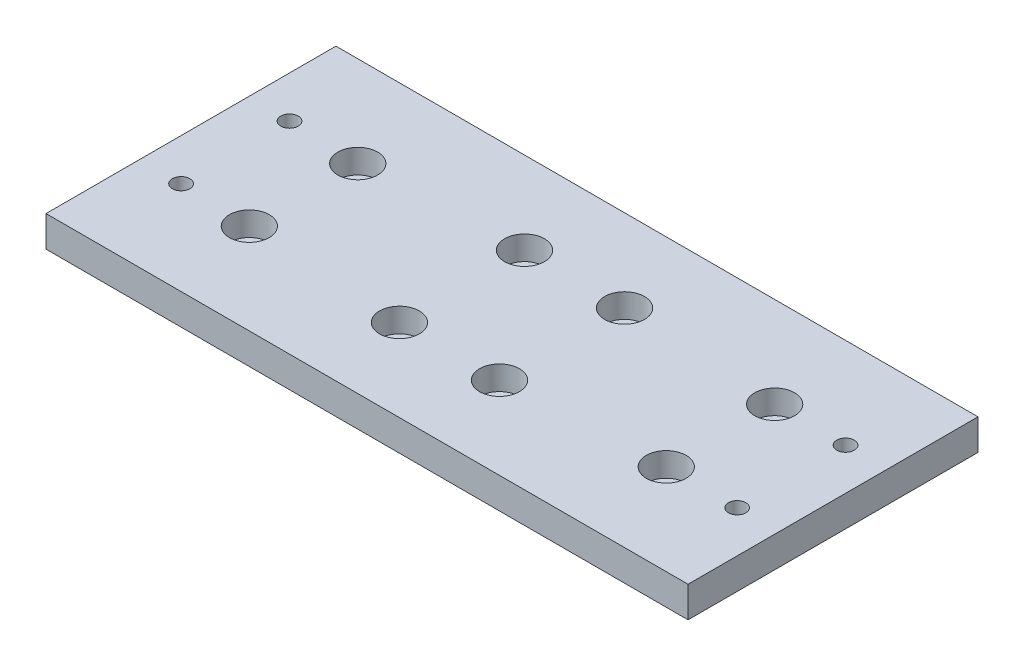
ISO-10303-21;
HEADER;
FILE_DESCRIPTION(('STEP AP214'),'2;1');
FILE_NAME('part.step','',(''),(''),'','','');
FILE_SCHEMA(('AUTOMOTIVE_DESIGN { 1 0 10303 214 1 1 1 1 }'));
ENDSEC;
DATA;
#1=APPLICATION_CONTEXT('core data for automotive mechanical design processes');
#2=APPLICATION_PROTOCOL_DEFINITION('international standard','automotive_design',2000,#1);
#3=PRODUCT_CONTEXT('',#1,'mechanical');
#4=PRODUCT('Part','Part','',(#3));
#5=PRODUCT_RELATED_PRODUCT_CATEGORY('part','',(#4));
#6=PRODUCT_DEFINITION_FORMATION('','',#4);
#7=PRODUCT_DEFINITION_CONTEXT('part definition',#1,'design');
#8=PRODUCT_DEFINITION('design','',#6,#7);
#9=PRODUCT_DEFINITION_SHAPE('','',#8);
#10=(LENGTH_UNIT() NAMED_UNIT(*) SI_UNIT(.MILLI.,.METRE.));
#11=(NAMED_UNIT(*) PLANE_ANGLE_UNIT() SI_UNIT($,.RADIAN.));
#12=(NAMED_UNIT(*) SI_UNIT($,.STERADIAN.) SOLID_ANGLE_UNIT());
#13=UNCERTAINTY_MEASURE_WITH_UNIT(LENGTH_MEASURE(1.E-05),#10,'distance_accuracy_value','');
#14=(GEOMETRIC_REPRESENTATION_CONTEXT(3) GLOBAL_UNCERTAINTY_ASSIGNED_CONTEXT((#13)) GLOBAL_UNIT_ASSIGNED_CONTEXT((#10,
#11,#12)) REPRESENTATION_CONTEXT('',''));
#15=CARTESIAN_POINT('',(0.,0.,0.));
#16=DIRECTION('',(0.,0.,1.));
#17=DIRECTION('',(1.,0.,0.));
#18=AXIS2_PLACEMENT_3D('',#15,#16,#17);
#19=CARTESIAN_POINT('',(-77.,-7.4,34.775));
#20=DIRECTION('',(-1.,0.,0.));
#21=DIRECTION('',(0.,0.,1.));
#22=AXIS2_PLACEMENT_3D('',#19,#20,#21);
#23=PLANE('',#22);
#24=DIRECTION('',(0.,0.,1.));
#25=VECTOR('',#24,1.);
#26=CARTESIAN_POINT('',(-77.,0.,34.775));
#27=LINE('',#26,#25);
#28=CARTESIAN_POINT('',(-77.,0.,-34.775));
#29=VERTEX_POINT('',#28);
#30=CARTESIAN_POINT('',(-77.,0.,34.775));
#31=VERTEX_POINT('',#30);
#32=EDGE_CURVE('E110',#29,#31,#27,.T.);
#33=ORIENTED_EDGE('',*,*,#32,.F.);
#34=DIRECTION('',(0.,1.,0.));
#35=VECTOR('',#34,1.);
#36=CARTESIAN_POINT('',(-77.,-7.4,-34.775));
#37=LINE('',#36,#35);
#38=CARTESIAN_POINT('',(-77.,-7.4,-34.775));
#39=VERTEX_POINT('',#38);
#40=EDGE_CURVE('E11',#39,#29,#37,.T.);
#41=ORIENTED_EDGE('',*,*,#40,.F.);
#42=DIRECTION('',(0.,0.,1.));
#43=VECTOR('',#42,1.);
#44=CARTESIAN_POINT('',(-77.,-7.4,34.775));
#45=LINE('',#44,#43);
#46=CARTESIAN_POINT('',(-77.,-7.4,34.775));
#47=VERTEX_POINT('',#46);
#48=EDGE_CURVE('E99',#39,#47,#45,.T.);
#49=ORIENTED_EDGE('',*,*,#48,.T.);
#50=DIRECTION('',(0.,1.,0.));
#51=VECTOR('',#50,1.);
#52=CARTESIAN_POINT('',(-77.,-7.4,34.775));
#53=LINE('',#52,#51);
#54=EDGE_CURVE('E44',#47,#31,#53,.T.);
#55=ORIENTED_EDGE('',*,*,#54,.T.);
#56=EDGE_LOOP('',(#33,#41,#49,#55));
#57=FACE_BOUND('',#56,.T.);
#58=ADVANCED_FACE('F45',(#57),#23,.T.);
#59=CARTESIAN_POINT('',(77.,-7.4,-34.775));
#60=DIRECTION('',(0.,0.,-1.));
#61=DIRECTION('',(-1.,0.,0.));
#62=AXIS2_PLACEMENT_3D('',#59,#60,#61);
#63=PLANE('',#62);
#64=DIRECTION('',(-1.,0.,0.));
#65=VECTOR('',#64,1.);
#66=CARTESIAN_POINT('',(77.,0.,-34.775));
#67=LINE('',#66,#65);
#68=CARTESIAN_POINT('',(77.,0.,-34.775));
#69=VERTEX_POINT('',#68);
#70=EDGE_CURVE('E105',#69,#29,#67,.T.);
#71=ORIENTED_EDGE('',*,*,#70,.F.);
#72=DIRECTION('',(0.,1.,0.));
#73=VECTOR('',#72,1.);
#74=CARTESIAN_POINT('',(77.,-7.4,-34.775));
#75=LINE('',#74,#73);
#76=CARTESIAN_POINT('',(77.,-7.4,-34.775));
#77=VERTEX_POINT('',#76);
#78=EDGE_CURVE('E51',#77,#69,#75,.T.);
#79=ORIENTED_EDGE('',*,*,#78,.F.);
#80=DIRECTION('',(-1.,0.,0.));
#81=VECTOR('',#80,1.);
#82=CARTESIAN_POINT('',(77.,-7.4,-34.775));
#83=LINE('',#82,#81);
#84=EDGE_CURVE('E100',#77,#39,#83,.T.);
#85=ORIENTED_EDGE('',*,*,#84,.T.);
#86=ORIENTED_EDGE('',*,*,#40,.T.);
#87=EDGE_LOOP('',(#71,#79,#85,#86));
#88=FACE_BOUND('',#87,.T.);
#89=ADVANCED_FACE('F119',(#88),#63,.T.);
#90=CARTESIAN_POINT('',(77.,-7.4,34.775));
#91=DIRECTION('',(1.,0.,0.));
#92=DIRECTION('',(0.,0.,-1.));
#93=AXIS2_PLACEMENT_3D('',#90,#91,#92);
#94=PLANE('',#93);
#95=DIRECTION('',(0.,0.,-1.));
#96=VECTOR('',#95,1.);
#97=CARTESIAN_POINT('',(77.,0.,34.775));
#98=LINE('',#97,#96);
#99=CARTESIAN_POINT('',(77.,0.,34.775));
#100=VERTEX_POINT('',#99);
#101=EDGE_CURVE('E95',#100,#69,#98,.T.);
#102=ORIENTED_EDGE('',*,*,#101,.F.);
#103=DIRECTION('',(0.,1.,0.));
#104=VECTOR('',#103,1.);
#105=CARTESIAN_POINT('',(77.,-7.4,34.775));
#106=LINE('',#105,#104);
#107=CARTESIAN_POINT('',(77.,-7.4,34.775));
#108=VERTEX_POINT('',#107);
#109=EDGE_CURVE('E87',#108,#100,#106,.T.);
#110=ORIENTED_EDGE('',*,*,#109,.F.);
#111=DIRECTION('',(0.,0.,-1.));
#112=VECTOR('',#111,1.);
#113=CARTESIAN_POINT('',(77.,-7.4,34.775));
#114=LINE('',#113,#112);
#115=EDGE_CURVE('E89',#108,#77,#114,.T.);
#116=ORIENTED_EDGE('',*,*,#115,.T.);
#117=ORIENTED_EDGE('',*,*,#78,.T.);
#118=EDGE_LOOP('',(#102,#110,#116,#117));
#119=FACE_BOUND('',#118,.T.);
#120=ADVANCED_FACE('F90',(#119),#94,.T.);
#121=CARTESIAN_POINT('',(77.,-7.4,34.775));
#122=DIRECTION('',(0.,0.,1.));
#123=DIRECTION('',(1.,0.,0.));
#124=AXIS2_PLACEMENT_3D('',#121,#122,#123);
#125=PLANE('',#124);
#126=DIRECTION('',(1.,0.,0.));
#127=VECTOR('',#126,1.);
#128=CARTESIAN_POINT('',(77.,0.,34.775));
#129=LINE('',#128,#127);
#130=EDGE_CURVE('E109',#31,#100,#129,.T.);
#131=ORIENTED_EDGE('',*,*,#130,.F.);
#132=ORIENTED_EDGE('',*,*,#54,.F.);
#133=DIRECTION('',(1.,0.,0.));
#134=VECTOR('',#133,1.);
#135=CARTESIAN_POINT('',(77.,-7.4,34.775));
#136=LINE('',#135,#134);
#137=EDGE_CURVE('E96',#47,#108,#136,.T.);
#138=ORIENTED_EDGE('',*,*,#137,.T.);
#139=ORIENTED_EDGE('',*,*,#109,.T.);
#140=EDGE_LOOP('',(#131,#132,#138,#139));
#141=FACE_BOUND('',#140,.T.);
#142=ADVANCED_FACE('F97',(#141),#125,.T.);
#143=CARTESIAN_POINT('',(0.,-7.4,0.));
#144=DIRECTION('',(0.,1.,0.));
#145=DIRECTION('',(0.,0.,1.));
#146=AXIS2_PLACEMENT_3D('',#143,#144,#145);
#147=PLANE('',#146);
#148=CARTESIAN_POINT('',(-67.,-7.4,12.3735439380438));
#149=DIRECTION('',(0.,1.,0.));
#150=DIRECTION('',(0.,0.,1.));
#151=AXIS2_PLACEMENT_3D('',#148,#149,#150);
#152=CIRCLE('',#151,2.1);
#153=CARTESIAN_POINT('',(-67.,-7.4,14.4735439380438));
#154=VERTEX_POINT('',#153);
#155=EDGE_CURVE('E275',#154,#154,#152,.T.);
#156=ORIENTED_EDGE('',*,*,#155,.T.);
#157=EDGE_LOOP('',(#156));
#158=FACE_BOUND('',#157,.T.);
#159=CARTESIAN_POINT('',(67.,-7.4,-13.));
#160=DIRECTION('',(0.,1.,0.));
#161=DIRECTION('',(0.,0.,1.));
#162=AXIS2_PLACEMENT_3D('',#159,#160,#161);
#163=CIRCLE('',#162,2.1);
#164=CARTESIAN_POINT('',(67.,-7.4,-10.9));
#165=VERTEX_POINT('',#164);
#166=EDGE_CURVE('E261',#165,#165,#163,.T.);
#167=ORIENTED_EDGE('',*,*,#166,.T.);
#168=EDGE_LOOP('',(#167));
#169=FACE_BOUND('',#168,.T.);
#170=CARTESIAN_POINT('',(67.,-7.4,13.));
#171=DIRECTION('',(0.,1.,0.));
#172=DIRECTION('',(0.,0.,1.));
#173=AXIS2_PLACEMENT_3D('',#170,#171,#172);
#174=CIRCLE('',#173,2.1);
#175=CARTESIAN_POINT('',(67.,-7.4,15.1));
#176=VERTEX_POINT('',#175);
#177=EDGE_CURVE('E258',#176,#176,#174,.T.);
#178=ORIENTED_EDGE('',*,*,#177,.T.);
#179=EDGE_LOOP('',(#178));
#180=FACE_BOUND('',#179,.T.);
#181=CARTESIAN_POINT('',(-67.,-7.4,-13.6264560619562));
#182=DIRECTION('',(0.,1.,0.));
#183=DIRECTION('',(0.,0.,1.));
#184=AXIS2_PLACEMENT_3D('',#181,#182,#183);
#185=CIRCLE('',#184,2.1);
#186=CARTESIAN_POINT('',(-67.,-7.4,-11.5264560619562));
#187=VERTEX_POINT('',#186);
#188=EDGE_CURVE('E277',#187,#187,#185,.T.);
#189=ORIENTED_EDGE('',*,*,#188,.T.);
#190=EDGE_LOOP('',(#189));
#191=FACE_BOUND('',#190,.T.);
#192=CARTESIAN_POINT('',(-50.,-7.4,13.));
#193=DIRECTION('',(0.,1.,0.));
#194=DIRECTION('',(0.,0.,1.));
#195=AXIS2_PLACEMENT_3D('',#192,#193,#194);
#196=CIRCLE('',#195,2.65);
#197=CARTESIAN_POINT('',(-50.,-7.4,15.65));
#198=VERTEX_POINT('',#197);
#199=EDGE_CURVE('E301',#198,#198,#196,.T.);
#200=ORIENTED_EDGE('',*,*,#199,.T.);
#201=EDGE_LOOP('',(#200));
#202=FACE_BOUND('',#201,.T.);
#203=CARTESIAN_POINT('',(-12.,-7.4,-15.));
#204=DIRECTION('',(0.,1.,0.));
#205=DIRECTION('',(0.,0.,1.));
#206=AXIS2_PLACEMENT_3D('',#203,#204,#205);
#207=CIRCLE('',#206,2.65);
#208=CARTESIAN_POINT('',(-12.,-7.4,-12.35));
#209=VERTEX_POINT('',#208);
#210=EDGE_CURVE('E309',#209,#209,#207,.T.);
#211=ORIENTED_EDGE('',*,*,#210,.T.);
#212=EDGE_LOOP('',(#211));
#213=FACE_BOUND('',#212,.T.);
#214=CARTESIAN_POINT('',(12.,-7.4,-15.));
#215=DIRECTION('',(0.,1.,0.));
#216=DIRECTION('',(0.,0.,1.));
#217=AXIS2_PLACEMENT_3D('',#214,#215,#216);
#218=CIRCLE('',#217,2.65);
#219=CARTESIAN_POINT('',(12.,-7.4,-12.35));
#220=VERTEX_POINT('',#219);
#221=EDGE_CURVE('E316',#220,#220,#218,.T.);
#222=ORIENTED_EDGE('',*,*,#221,.T.);
#223=EDGE_LOOP('',(#222));
#224=FACE_BOUND('',#223,.T.);
#225=CARTESIAN_POINT('',(12.,-7.4,15.));
#226=DIRECTION('',(0.,1.,0.));
#227=DIRECTION('',(0.,0.,1.));
#228=AXIS2_PLACEMENT_3D('',#225,#226,#227);
#229=CIRCLE('',#228,2.65);
#230=CARTESIAN_POINT('',(12.,-7.4,17.65));
#231=VERTEX_POINT('',#230);
#232=EDGE_CURVE('E285',#231,#231,#229,.T.);
#233=ORIENTED_EDGE('',*,*,#232,.T.);
#234=EDGE_LOOP('',(#233));
#235=FACE_BOUND('',#234,.T.);
#236=CARTESIAN_POINT('',(50.,-7.4,-13.));
#237=DIRECTION('',(0.,1.,0.));
#238=DIRECTION('',(0.,0.,1.));
#239=AXIS2_PLACEMENT_3D('',#236,#237,#238);
#240=CIRCLE('',#239,2.65);
#241=CARTESIAN_POINT('',(50.,-7.4,-10.35));
#242=VERTEX_POINT('',#241);
#243=EDGE_CURVE('E287',#242,#242,#240,.T.);
#244=ORIENTED_EDGE('',*,*,#243,.T.);
#245=EDGE_LOOP('',(#244));
#246=FACE_BOUND('',#245,.T.);
#247=CARTESIAN_POINT('',(50.,-7.4,13.));
#248=DIRECTION('',(0.,1.,0.));
#249=DIRECTION('',(0.,0.,1.));
#250=AXIS2_PLACEMENT_3D('',#247,#248,#249);
#251=CIRCLE('',#250,2.65);
#252=CARTESIAN_POINT('',(50.,-7.4,15.65));
#253=VERTEX_POINT('',#252);
#254=EDGE_CURVE('E295',#253,#253,#251,.T.);
#255=ORIENTED_EDGE('',*,*,#254,.T.);
#256=EDGE_LOOP('',(#255));
#257=FACE_BOUND('',#256,.T.);
#258=CARTESIAN_POINT('',(-12.,-7.4,15.));
#259=DIRECTION('',(0.,1.,0.));
#260=DIRECTION('',(0.,0.,1.));
#261=AXIS2_PLACEMENT_3D('',#258,#259,#260);
#262=CIRCLE('',#261,2.65);
#263=CARTESIAN_POINT('',(-12.,-7.4,17.65));
#264=VERTEX_POINT('',#263);
#265=EDGE_CURVE('E276',#264,#264,#262,.T.);
#266=ORIENTED_EDGE('',*,*,#265,.T.);
#267=EDGE_LOOP('',(#266));
#268=FACE_BOUND('',#267,.T.);
#269=CARTESIAN_POINT('',(-50.,-7.4,-13.));
#270=DIRECTION('',(0.,1.,0.));
#271=DIRECTION('',(0.,0.,1.));
#272=AXIS2_PLACEMENT_3D('',#269,#270,#271);
#273=CIRCLE('',#272,2.65);
#274=CARTESIAN_POINT('',(-50.,-7.4,-10.35));
#275=VERTEX_POINT('',#274);
#276=EDGE_CURVE('E322',#275,#275,#273,.T.);
#277=ORIENTED_EDGE('',*,*,#276,.T.);
#278=EDGE_LOOP('',(#277));
#279=FACE_BOUND('',#278,.T.);
#280=ORIENTED_EDGE('',*,*,#48,.F.);
#281=ORIENTED_EDGE('',*,*,#84,.F.);
#282=ORIENTED_EDGE('',*,*,#115,.F.);
#283=ORIENTED_EDGE('',*,*,#137,.F.);
#284=EDGE_LOOP('',(#280,#281,#282,#283));
#285=FACE_BOUND('',#284,.T.);
#286=ADVANCED_FACE('F92',(#158,#169,#180,#191,#202,#213,#224,#235,#246,#257,#268,#279,#285),
#147,.F.);
#287=CARTESIAN_POINT('',(0.,0.,0.));
#288=DIRECTION('',(0.,1.,0.));
#289=DIRECTION('',(0.,0.,1.));
#290=AXIS2_PLACEMENT_3D('',#287,#288,#289);
#291=PLANE('',#290);
#292=CARTESIAN_POINT('',(-67.,0.,12.3735439380438));
#293=DIRECTION('',(0.,1.,0.));
#294=DIRECTION('',(0.,0.,1.));
#295=AXIS2_PLACEMENT_3D('',#292,#293,#294);
#296=CIRCLE('',#295,2.1);
#297=CARTESIAN_POINT('',(-67.,0.,14.4735439380438));
#298=VERTEX_POINT('',#297);
#299=EDGE_CURVE('E268',#298,#298,#296,.T.);
#300=ORIENTED_EDGE('',*,*,#299,.F.);
#301=EDGE_LOOP('',(#300));
#302=FACE_BOUND('',#301,.T.);
#303=CARTESIAN_POINT('',(67.,0.,-13.));
#304=DIRECTION('',(0.,1.,0.));
#305=DIRECTION('',(0.,0.,1.));
#306=AXIS2_PLACEMENT_3D('',#303,#304,#305);
#307=CIRCLE('',#306,2.1);
#308=CARTESIAN_POINT('',(67.,0.,-10.9));
#309=VERTEX_POINT('',#308);
#310=EDGE_CURVE('E262',#309,#309,#307,.T.);
#311=ORIENTED_EDGE('',*,*,#310,.F.);
#312=EDGE_LOOP('',(#311));
#313=FACE_BOUND('',#312,.T.);
#314=CARTESIAN_POINT('',(67.,0.,13.));
#315=DIRECTION('',(0.,1.,0.));
#316=DIRECTION('',(0.,0.,1.));
#317=AXIS2_PLACEMENT_3D('',#314,#315,#316);
#318=CIRCLE('',#317,2.1);
#319=CARTESIAN_POINT('',(67.,0.,15.1));
#320=VERTEX_POINT('',#319);
#321=EDGE_CURVE('E259',#320,#320,#318,.T.);
#322=ORIENTED_EDGE('',*,*,#321,.F.);
#323=EDGE_LOOP('',(#322));
#324=FACE_BOUND('',#323,.T.);
#325=CARTESIAN_POINT('',(-67.,0.,-13.6264560619562));
#326=DIRECTION('',(0.,1.,0.));
#327=DIRECTION('',(0.,0.,1.));
#328=AXIS2_PLACEMENT_3D('',#325,#326,#327);
#329=CIRCLE('',#328,2.1);
#330=CARTESIAN_POINT('',(-67.,0.,-11.5264560619562));
#331=VERTEX_POINT('',#330);
#332=EDGE_CURVE('E271',#331,#331,#329,.T.);
#333=ORIENTED_EDGE('',*,*,#332,.F.);
#334=EDGE_LOOP('',(#333));
#335=FACE_BOUND('',#334,.T.);
#336=CARTESIAN_POINT('',(12.,0.,-15.));
#337=DIRECTION('',(0.,1.,0.));
#338=DIRECTION('',(0.,0.,1.));
#339=AXIS2_PLACEMENT_3D('',#336,#337,#338);
#340=CIRCLE('',#339,4.775);
#341=CARTESIAN_POINT('',(12.,0.,-10.225));
#342=VERTEX_POINT('',#341);
#343=EDGE_CURVE('E346',#342,#342,#340,.T.);
#344=ORIENTED_EDGE('',*,*,#343,.F.);
#345=EDGE_LOOP('',(#344));
#346=FACE_BOUND('',#345,.T.);
#347=CARTESIAN_POINT('',(-12.,0.,-15.));
#348=DIRECTION('',(0.,1.,0.));
#349=DIRECTION('',(0.,0.,1.));
#350=AXIS2_PLACEMENT_3D('',#347,#348,#349);
#351=CIRCLE('',#350,4.775);
#352=CARTESIAN_POINT('',(-12.,0.,-10.225));
#353=VERTEX_POINT('',#352);
#354=EDGE_CURVE('E355',#353,#353,#351,.T.);
#355=ORIENTED_EDGE('',*,*,#354,.F.);
#356=EDGE_LOOP('',(#355));
#357=FACE_BOUND('',#356,.T.);
#358=CARTESIAN_POINT('',(-50.,0.,13.));
#359=DIRECTION('',(0.,1.,0.));
#360=DIRECTION('',(0.,0.,1.));
#361=AXIS2_PLACEMENT_3D('',#358,#359,#360);
#362=CIRCLE('',#361,4.775);
#363=CARTESIAN_POINT('',(-50.,0.,17.775));
#364=VERTEX_POINT('',#363);
#365=EDGE_CURVE('E363',#364,#364,#362,.T.);
#366=ORIENTED_EDGE('',*,*,#365,.F.);
#367=EDGE_LOOP('',(#366));
#368=FACE_BOUND('',#367,.T.);
#369=CARTESIAN_POINT('',(12.,0.,15.));
#370=DIRECTION('',(0.,1.,0.));
#371=DIRECTION('',(0.,0.,1.));
#372=AXIS2_PLACEMENT_3D('',#369,#370,#371);
#373=CIRCLE('',#372,4.775);
#374=CARTESIAN_POINT('',(12.,0.,19.775));
#375=VERTEX_POINT('',#374);
#376=EDGE_CURVE('E370',#375,#375,#373,.T.);
#377=ORIENTED_EDGE('',*,*,#376,.F.);
#378=EDGE_LOOP('',(#377));
#379=FACE_BOUND('',#378,.T.);
#380=CARTESIAN_POINT('',(50.,0.,-13.));
#381=DIRECTION('',(0.,1.,0.));
#382=DIRECTION('',(0.,0.,1.));
#383=AXIS2_PLACEMENT_3D('',#380,#381,#382);
#384=CIRCLE('',#383,4.775);
#385=CARTESIAN_POINT('',(50.,0.,-8.225));
#386=VERTEX_POINT('',#385);
#387=EDGE_CURVE('E329',#386,#386,#384,.T.);
#388=ORIENTED_EDGE('',*,*,#387,.F.);
#389=EDGE_LOOP('',(#388));
#390=FACE_BOUND('',#389,.T.);
#391=CARTESIAN_POINT('',(50.,0.,13.));
#392=DIRECTION('',(0.,1.,0.));
#393=DIRECTION('',(0.,0.,1.));
#394=AXIS2_PLACEMENT_3D('',#391,#392,#393);
#395=CIRCLE('',#394,4.775);
#396=CARTESIAN_POINT('',(50.,0.,17.775));
#397=VERTEX_POINT('',#396);
#398=EDGE_CURVE('E337',#397,#397,#395,.T.);
#399=ORIENTED_EDGE('',*,*,#398,.F.);
#400=EDGE_LOOP('',(#399));
#401=FACE_BOUND('',#400,.T.);
#402=CARTESIAN_POINT('',(-12.,0.,15.));
#403=DIRECTION('',(0.,1.,0.));
#404=DIRECTION('',(0.,0.,1.));
#405=AXIS2_PLACEMENT_3D('',#402,#403,#404);
#406=CIRCLE('',#405,4.775);
#407=CARTESIAN_POINT('',(-12.,0.,19.775));
#408=VERTEX_POINT('',#407);
#409=EDGE_CURVE('E343',#408,#408,#406,.T.);
#410=ORIENTED_EDGE('',*,*,#409,.F.);
#411=EDGE_LOOP('',(#410));
#412=FACE_BOUND('',#411,.T.);
#413=CARTESIAN_POINT('',(-50.,0.,-13.));
#414=DIRECTION('',(0.,1.,0.));
#415=DIRECTION('',(0.,0.,1.));
#416=AXIS2_PLACEMENT_3D('',#413,#414,#415);
#417=CIRCLE('',#416,4.775);
#418=CARTESIAN_POINT('',(-50.,0.,-8.225));
#419=VERTEX_POINT('',#418);
#420=EDGE_CURVE('E351',#419,#419,#417,.T.);
#421=ORIENTED_EDGE('',*,*,#420,.F.);
#422=EDGE_LOOP('',(#421));
#423=FACE_BOUND('',#422,.T.);
#424=ORIENTED_EDGE('',*,*,#32,.T.);
#425=ORIENTED_EDGE('',*,*,#130,.T.);
#426=ORIENTED_EDGE('',*,*,#101,.T.);
#427=ORIENTED_EDGE('',*,*,#70,.T.);
#428=EDGE_LOOP('',(#424,#425,#426,#427));
#429=FACE_BOUND('',#428,.T.);
#430=ADVANCED_FACE('F117',(#302,#313,#324,#335,#346,#357,#368,#379,#390,#401,#412,#423,#429),
#291,.T.);
#431=CARTESIAN_POINT('',(-50.,-5.75,-13.));
#432=DIRECTION('',(0.,1.,0.));
#433=DIRECTION('',(0.,0.,1.));
#434=AXIS2_PLACEMENT_3D('',#431,#432,#433);
#435=CYLINDRICAL_SURFACE('',#434,4.775);
#436=CARTESIAN_POINT('',(-50.,-5.75,-13.));
#437=DIRECTION('',(0.,1.,0.));
#438=DIRECTION('',(0.,0.,1.));
#439=AXIS2_PLACEMENT_3D('',#436,#437,#438);
#440=CIRCLE('',#439,4.775);
#441=CARTESIAN_POINT('',(-50.,-5.75,-8.225));
#442=VERTEX_POINT('',#441);
#443=EDGE_CURVE('E112',#442,#442,#440,.T.);
#444=ORIENTED_EDGE('',*,*,#443,.F.);
#445=EDGE_LOOP('',(#444));
#446=FACE_BOUND('',#445,.T.);
#447=ORIENTED_EDGE('',*,*,#420,.T.);
#448=EDGE_LOOP('',(#447));
#449=FACE_BOUND('',#448,.T.);
#450=ADVANCED_FACE('F140',(#446,#449),#435,.F.);
#451=CARTESIAN_POINT('',(-50.,-5.75,-13.));
#452=DIRECTION('',(0.,1.,0.));
#453=DIRECTION('',(0.,0.,1.));
#454=AXIS2_PLACEMENT_3D('',#451,#452,#453);
#455=PLANE('',#454);
#456=CARTESIAN_POINT('',(-50.,-5.75,-13.));
#457=DIRECTION('',(0.,1.,0.));
#458=DIRECTION('',(0.,0.,1.));
#459=AXIS2_PLACEMENT_3D('',#456,#457,#458);
#460=CIRCLE('',#459,2.65);
#461=CARTESIAN_POINT('',(-50.,-5.75,-10.35));
#462=VERTEX_POINT('',#461);
#463=EDGE_CURVE('E305',#462,#462,#460,.T.);
#464=ORIENTED_EDGE('',*,*,#463,.F.);
#465=EDGE_LOOP('',(#464));
#466=FACE_BOUND('',#465,.T.);
#467=ORIENTED_EDGE('',*,*,#443,.T.);
#468=EDGE_LOOP('',(#467));
#469=FACE_BOUND('',#468,.T.);
#470=ADVANCED_FACE('F145',(#466,#469),#455,.T.);
#471=CARTESIAN_POINT('',(-12.,-5.75,15.));
#472=DIRECTION('',(0.,1.,0.));
#473=DIRECTION('',(0.,0.,1.));
#474=AXIS2_PLACEMENT_3D('',#471,#472,#473);
#475=CYLINDRICAL_SURFACE('',#474,4.775);
#476=CARTESIAN_POINT('',(-12.,-5.75,15.));
#477=DIRECTION('',(0.,1.,0.));
#478=DIRECTION('',(0.,0.,1.));
#479=AXIS2_PLACEMENT_3D('',#476,#477,#478);
#480=CIRCLE('',#479,4.775);
#481=CARTESIAN_POINT('',(-12.,-5.75,19.775));
#482=VERTEX_POINT('',#481);
#483=EDGE_CURVE('E330',#482,#482,#480,.T.);
#484=ORIENTED_EDGE('',*,*,#483,.F.);
#485=EDGE_LOOP('',(#484));
#486=FACE_BOUND('',#485,.T.);
#487=ORIENTED_EDGE('',*,*,#409,.T.);
#488=EDGE_LOOP('',(#487));
#489=FACE_BOUND('',#488,.T.);
#490=ADVANCED_FACE('F146',(#486,#489),#475,.F.);
#491=CARTESIAN_POINT('',(-12.,-5.75,15.));
#492=DIRECTION('',(0.,1.,0.));
#493=DIRECTION('',(0.,0.,1.));
#494=AXIS2_PLACEMENT_3D('',#491,#492,#493);
#495=PLANE('',#494);
#496=CARTESIAN_POINT('',(-12.,-5.75,15.));
#497=DIRECTION('',(0.,1.,0.));
#498=DIRECTION('',(0.,0.,1.));
#499=AXIS2_PLACEMENT_3D('',#496,#497,#498);
#500=CIRCLE('',#499,2.65);
#501=CARTESIAN_POINT('',(-12.,-5.75,17.65));
#502=VERTEX_POINT('',#501);
#503=EDGE_CURVE('E293',#502,#502,#500,.T.);
#504=ORIENTED_EDGE('',*,*,#503,.F.);
#505=EDGE_LOOP('',(#504));
#506=FACE_BOUND('',#505,.T.);
#507=ORIENTED_EDGE('',*,*,#483,.T.);
#508=EDGE_LOOP('',(#507));
#509=FACE_BOUND('',#508,.T.);
#510=ADVANCED_FACE('F184',(#506,#509),#495,.T.);
#511=CARTESIAN_POINT('',(50.,-5.75,13.));
#512=DIRECTION('',(0.,1.,0.));
#513=DIRECTION('',(0.,0.,1.));
#514=AXIS2_PLACEMENT_3D('',#511,#512,#513);
#515=CYLINDRICAL_SURFACE('',#514,4.775);
#516=CARTESIAN_POINT('',(50.,-5.75,13.));
#517=DIRECTION('',(0.,1.,0.));
#518=DIRECTION('',(0.,0.,1.));
#519=AXIS2_PLACEMENT_3D('',#516,#517,#518);
#520=CIRCLE('',#519,4.775);
#521=CARTESIAN_POINT('',(50.,-5.75,17.775));
#522=VERTEX_POINT('',#521);
#523=EDGE_CURVE('E340',#522,#522,#520,.T.);
#524=ORIENTED_EDGE('',*,*,#523,.F.);
#525=EDGE_LOOP('',(#524));
#526=FACE_BOUND('',#525,.T.);
#527=ORIENTED_EDGE('',*,*,#398,.T.);
#528=EDGE_LOOP('',(#527));
#529=FACE_BOUND('',#528,.T.);
#530=ADVANCED_FACE('F187',(#526,#529),#515,.F.);
#531=CARTESIAN_POINT('',(50.,-5.75,13.));
#532=DIRECTION('',(0.,1.,0.));
#533=DIRECTION('',(0.,0.,1.));
#534=AXIS2_PLACEMENT_3D('',#531,#532,#533);
#535=PLANE('',#534);
#536=CARTESIAN_POINT('',(50.,-5.75,13.));
#537=DIRECTION('',(0.,1.,0.));
#538=DIRECTION('',(0.,0.,1.));
#539=AXIS2_PLACEMENT_3D('',#536,#537,#538);
#540=CIRCLE('',#539,2.65);
#541=CARTESIAN_POINT('',(50.,-5.75,15.65));
#542=VERTEX_POINT('',#541);
#543=EDGE_CURVE('E289',#542,#542,#540,.T.);
#544=ORIENTED_EDGE('',*,*,#543,.F.);
#545=EDGE_LOOP('',(#544));
#546=FACE_BOUND('',#545,.T.);
#547=ORIENTED_EDGE('',*,*,#523,.T.);
#548=EDGE_LOOP('',(#547));
#549=FACE_BOUND('',#548,.T.);
#550=ADVANCED_FACE('F194',(#546,#549),#535,.T.);
#551=CARTESIAN_POINT('',(50.,-5.75,-13.));
#552=DIRECTION('',(0.,1.,0.));
#553=DIRECTION('',(0.,0.,1.));
#554=AXIS2_PLACEMENT_3D('',#551,#552,#553);
#555=CYLINDRICAL_SURFACE('',#554,4.775);
#556=CARTESIAN_POINT('',(50.,-5.75,-13.));
#557=DIRECTION('',(0.,1.,0.));
#558=DIRECTION('',(0.,0.,1.));
#559=AXIS2_PLACEMENT_3D('',#556,#557,#558);
#560=CIRCLE('',#559,4.775);
#561=CARTESIAN_POINT('',(50.,-5.75,-8.225));
#562=VERTEX_POINT('',#561);
#563=EDGE_CURVE('E331',#562,#562,#560,.T.);
#564=ORIENTED_EDGE('',*,*,#563,.F.);
#565=EDGE_LOOP('',(#564));
#566=FACE_BOUND('',#565,.T.);
#567=ORIENTED_EDGE('',*,*,#387,.T.);
#568=EDGE_LOOP('',(#567));
#569=FACE_BOUND('',#568,.T.);
#570=ADVANCED_FACE('F193',(#566,#569),#555,.F.);
#571=CARTESIAN_POINT('',(50.,-5.75,-13.));
#572=DIRECTION('',(0.,1.,0.));
#573=DIRECTION('',(0.,0.,1.));
#574=AXIS2_PLACEMENT_3D('',#571,#572,#573);
#575=PLANE('',#574);
#576=CARTESIAN_POINT('',(50.,-5.75,-13.));
#577=DIRECTION('',(0.,1.,0.));
#578=DIRECTION('',(0.,0.,1.));
#579=AXIS2_PLACEMENT_3D('',#576,#577,#578);
#580=CIRCLE('',#579,2.65);
#581=CARTESIAN_POINT('',(50.,-5.75,-10.35));
#582=VERTEX_POINT('',#581);
#583=EDGE_CURVE('E282',#582,#582,#580,.T.);
#584=ORIENTED_EDGE('',*,*,#583,.F.);
#585=EDGE_LOOP('',(#584));
#586=FACE_BOUND('',#585,.T.);
#587=ORIENTED_EDGE('',*,*,#563,.T.);
#588=EDGE_LOOP('',(#587));
#589=FACE_BOUND('',#588,.T.);
#590=ADVANCED_FACE('F158',(#586,#589),#575,.T.);
#591=CARTESIAN_POINT('',(12.,-5.75,15.));
#592=DIRECTION('',(0.,1.,0.));
#593=DIRECTION('',(0.,0.,1.));
#594=AXIS2_PLACEMENT_3D('',#591,#592,#593);
#595=CYLINDRICAL_SURFACE('',#594,4.775);
#596=CARTESIAN_POINT('',(12.,-5.75,15.));
#597=DIRECTION('',(0.,1.,0.));
#598=DIRECTION('',(0.,0.,1.));
#599=AXIS2_PLACEMENT_3D('',#596,#597,#598);
#600=CIRCLE('',#599,4.775);
#601=CARTESIAN_POINT('',(12.,-5.75,19.775));
#602=VERTEX_POINT('',#601);
#603=EDGE_CURVE('E334',#602,#602,#600,.T.);
#604=ORIENTED_EDGE('',*,*,#603,.F.);
#605=EDGE_LOOP('',(#604));
#606=FACE_BOUND('',#605,.T.);
#607=ORIENTED_EDGE('',*,*,#376,.T.);
#608=EDGE_LOOP('',(#607));
#609=FACE_BOUND('',#608,.T.);
#610=ADVANCED_FACE('F152',(#606,#609),#595,.F.);
#611=CARTESIAN_POINT('',(12.,-5.75,15.));
#612=DIRECTION('',(0.,1.,0.));
#613=DIRECTION('',(0.,0.,1.));
#614=AXIS2_PLACEMENT_3D('',#611,#612,#613);
#615=PLANE('',#614);
#616=CARTESIAN_POINT('',(12.,-5.75,15.));
#617=DIRECTION('',(0.,1.,0.));
#618=DIRECTION('',(0.,0.,1.));
#619=AXIS2_PLACEMENT_3D('',#616,#617,#618);
#620=CIRCLE('',#619,2.65);
#621=CARTESIAN_POINT('',(12.,-5.75,17.65));
#622=VERTEX_POINT('',#621);
#623=EDGE_CURVE('E317',#622,#622,#620,.T.);
#624=ORIENTED_EDGE('',*,*,#623,.F.);
#625=EDGE_LOOP('',(#624));
#626=FACE_BOUND('',#625,.T.);
#627=ORIENTED_EDGE('',*,*,#603,.T.);
#628=EDGE_LOOP('',(#627));
#629=FACE_BOUND('',#628,.T.);
#630=ADVANCED_FACE('F147',(#626,#629),#615,.T.);
#631=CARTESIAN_POINT('',(-50.,-5.75,13.));
#632=DIRECTION('',(0.,1.,0.));
#633=DIRECTION('',(0.,0.,1.));
#634=AXIS2_PLACEMENT_3D('',#631,#632,#633);
#635=CYLINDRICAL_SURFACE('',#634,4.775);
#636=CARTESIAN_POINT('',(-50.,-5.75,13.));
#637=DIRECTION('',(0.,1.,0.));
#638=DIRECTION('',(0.,0.,1.));
#639=AXIS2_PLACEMENT_3D('',#636,#637,#638);
#640=CIRCLE('',#639,4.775);
#641=CARTESIAN_POINT('',(-50.,-5.75,17.775));
#642=VERTEX_POINT('',#641);
#643=EDGE_CURVE('E365',#642,#642,#640,.T.);
#644=ORIENTED_EDGE('',*,*,#643,.F.);
#645=EDGE_LOOP('',(#644));
#646=FACE_BOUND('',#645,.T.);
#647=ORIENTED_EDGE('',*,*,#365,.T.);
#648=EDGE_LOOP('',(#647));
#649=FACE_BOUND('',#648,.T.);
#650=ADVANCED_FACE('F153',(#646,#649),#635,.F.);
#651=CARTESIAN_POINT('',(-50.,-5.75,13.));
#652=DIRECTION('',(0.,1.,0.));
#653=DIRECTION('',(0.,0.,1.));
#654=AXIS2_PLACEMENT_3D('',#651,#652,#653);
#655=PLANE('',#654);
#656=CARTESIAN_POINT('',(-50.,-5.75,13.));
#657=DIRECTION('',(0.,1.,0.));
#658=DIRECTION('',(0.,0.,1.));
#659=AXIS2_PLACEMENT_3D('',#656,#657,#658);
#660=CIRCLE('',#659,2.65);
#661=CARTESIAN_POINT('',(-50.,-5.75,15.65));
#662=VERTEX_POINT('',#661);
#663=EDGE_CURVE('E300',#662,#662,#660,.T.);
#664=ORIENTED_EDGE('',*,*,#663,.F.);
#665=EDGE_LOOP('',(#664));
#666=FACE_BOUND('',#665,.T.);
#667=ORIENTED_EDGE('',*,*,#643,.T.);
#668=EDGE_LOOP('',(#667));
#669=FACE_BOUND('',#668,.T.);
#670=ADVANCED_FACE('F159',(#666,#669),#655,.T.);
#671=CARTESIAN_POINT('',(-12.,-5.75,-15.));
#672=DIRECTION('',(0.,1.,0.));
#673=DIRECTION('',(0.,0.,1.));
#674=AXIS2_PLACEMENT_3D('',#671,#672,#673);
#675=CYLINDRICAL_SURFACE('',#674,4.775);
#676=CARTESIAN_POINT('',(-12.,-5.75,-15.));
#677=DIRECTION('',(0.,1.,0.));
#678=DIRECTION('',(0.,0.,1.));
#679=AXIS2_PLACEMENT_3D('',#676,#677,#678);
#680=CIRCLE('',#679,4.775);
#681=CARTESIAN_POINT('',(-12.,-5.75,-10.225));
#682=VERTEX_POINT('',#681);
#683=EDGE_CURVE('E360',#682,#682,#680,.T.);
#684=ORIENTED_EDGE('',*,*,#683,.F.);
#685=EDGE_LOOP('',(#684));
#686=FACE_BOUND('',#685,.T.);
#687=ORIENTED_EDGE('',*,*,#354,.T.);
#688=EDGE_LOOP('',(#687));
#689=FACE_BOUND('',#688,.T.);
#690=ADVANCED_FACE('F162',(#686,#689),#675,.F.);
#691=CARTESIAN_POINT('',(-12.,-5.75,-15.));
#692=DIRECTION('',(0.,1.,0.));
#693=DIRECTION('',(0.,0.,1.));
#694=AXIS2_PLACEMENT_3D('',#691,#692,#693);
#695=PLANE('',#694);
#696=CARTESIAN_POINT('',(-12.,-5.75,-15.));
#697=DIRECTION('',(0.,1.,0.));
#698=DIRECTION('',(0.,0.,1.));
#699=AXIS2_PLACEMENT_3D('',#696,#697,#698);
#700=CIRCLE('',#699,2.65);
#701=CARTESIAN_POINT('',(-12.,-5.75,-12.35));
#702=VERTEX_POINT('',#701);
#703=EDGE_CURVE('E307',#702,#702,#700,.T.);
#704=ORIENTED_EDGE('',*,*,#703,.F.);
#705=EDGE_LOOP('',(#704));
#706=FACE_BOUND('',#705,.T.);
#707=ORIENTED_EDGE('',*,*,#683,.T.);
#708=EDGE_LOOP('',(#707));
#709=FACE_BOUND('',#708,.T.);
#710=ADVANCED_FACE('F169',(#706,#709),#695,.T.);
#711=CARTESIAN_POINT('',(12.,-5.75,-15.));
#712=DIRECTION('',(0.,1.,0.));
#713=DIRECTION('',(0.,0.,1.));
#714=AXIS2_PLACEMENT_3D('',#711,#712,#713);
#715=CYLINDRICAL_SURFACE('',#714,4.775);
#716=CARTESIAN_POINT('',(12.,-5.75,-15.));
#717=DIRECTION('',(0.,1.,0.));
#718=DIRECTION('',(0.,0.,1.));
#719=AXIS2_PLACEMENT_3D('',#716,#717,#718);
#720=CIRCLE('',#719,4.775);
#721=CARTESIAN_POINT('',(12.,-5.75,-10.225));
#722=VERTEX_POINT('',#721);
#723=EDGE_CURVE('E352',#722,#722,#720,.T.);
#724=ORIENTED_EDGE('',*,*,#723,.F.);
#725=EDGE_LOOP('',(#724));
#726=FACE_BOUND('',#725,.T.);
#727=ORIENTED_EDGE('',*,*,#343,.T.);
#728=EDGE_LOOP('',(#727));
#729=FACE_BOUND('',#728,.T.);
#730=ADVANCED_FACE('F171',(#726,#729),#715,.F.);
#731=CARTESIAN_POINT('',(12.,-5.75,-15.));
#732=DIRECTION('',(0.,1.,0.));
#733=DIRECTION('',(0.,0.,1.));
#734=AXIS2_PLACEMENT_3D('',#731,#732,#733);
#735=PLANE('',#734);
#736=CARTESIAN_POINT('',(12.,-5.75,-15.));
#737=DIRECTION('',(0.,1.,0.));
#738=DIRECTION('',(0.,0.,1.));
#739=AXIS2_PLACEMENT_3D('',#736,#737,#738);
#740=CIRCLE('',#739,2.65);
#741=CARTESIAN_POINT('',(12.,-5.75,-12.35));
#742=VERTEX_POINT('',#741);
#743=EDGE_CURVE('E311',#742,#742,#740,.T.);
#744=ORIENTED_EDGE('',*,*,#743,.F.);
#745=EDGE_LOOP('',(#744));
#746=FACE_BOUND('',#745,.T.);
#747=ORIENTED_EDGE('',*,*,#723,.T.);
#748=EDGE_LOOP('',(#747));
#749=FACE_BOUND('',#748,.T.);
#750=ADVANCED_FACE('F177',(#746,#749),#735,.T.);
#751=CARTESIAN_POINT('',(-50.,-7.4,-13.));
#752=DIRECTION('',(0.,1.,0.));
#753=DIRECTION('',(0.,0.,1.));
#754=AXIS2_PLACEMENT_3D('',#751,#752,#753);
#755=CYLINDRICAL_SURFACE('',#754,2.65);
#756=ORIENTED_EDGE('',*,*,#276,.F.);
#757=EDGE_LOOP('',(#756));
#758=FACE_BOUND('',#757,.T.);
#759=ORIENTED_EDGE('',*,*,#463,.T.);
#760=EDGE_LOOP('',(#759));
#761=FACE_BOUND('',#760,.T.);
#762=ADVANCED_FACE('F179',(#758,#761),#755,.F.);
#763=CARTESIAN_POINT('',(-12.,-7.4,15.));
#764=DIRECTION('',(0.,1.,0.));
#765=DIRECTION('',(0.,0.,1.));
#766=AXIS2_PLACEMENT_3D('',#763,#764,#765);
#767=CYLINDRICAL_SURFACE('',#766,2.65);
#768=ORIENTED_EDGE('',*,*,#265,.F.);
#769=EDGE_LOOP('',(#768));
#770=FACE_BOUND('',#769,.T.);
#771=ORIENTED_EDGE('',*,*,#503,.T.);
#772=EDGE_LOOP('',(#771));
#773=FACE_BOUND('',#772,.T.);
#774=ADVANCED_FACE('F208',(#770,#773),#767,.F.);
#775=CARTESIAN_POINT('',(50.,-7.4,13.));
#776=DIRECTION('',(0.,1.,0.));
#777=DIRECTION('',(0.,0.,1.));
#778=AXIS2_PLACEMENT_3D('',#775,#776,#777);
#779=CYLINDRICAL_SURFACE('',#778,2.65);
#780=ORIENTED_EDGE('',*,*,#254,.F.);
#781=EDGE_LOOP('',(#780));
#782=FACE_BOUND('',#781,.T.);
#783=ORIENTED_EDGE('',*,*,#543,.T.);
#784=EDGE_LOOP('',(#783));
#785=FACE_BOUND('',#784,.T.);
#786=ADVANCED_FACE('F228',(#782,#785),#779,.F.);
#787=CARTESIAN_POINT('',(50.,-7.4,-13.));
#788=DIRECTION('',(0.,1.,0.));
#789=DIRECTION('',(0.,0.,1.));
#790=AXIS2_PLACEMENT_3D('',#787,#788,#789);
#791=CYLINDRICAL_SURFACE('',#790,2.65);
#792=ORIENTED_EDGE('',*,*,#243,.F.);
#793=EDGE_LOOP('',(#792));
#794=FACE_BOUND('',#793,.T.);
#795=ORIENTED_EDGE('',*,*,#583,.T.);
#796=EDGE_LOOP('',(#795));
#797=FACE_BOUND('',#796,.T.);
#798=ADVANCED_FACE('F212',(#794,#797),#791,.F.);
#799=CARTESIAN_POINT('',(12.,-7.4,15.));
#800=DIRECTION('',(0.,1.,0.));
#801=DIRECTION('',(0.,0.,1.));
#802=AXIS2_PLACEMENT_3D('',#799,#800,#801);
#803=CYLINDRICAL_SURFACE('',#802,2.65);
#804=ORIENTED_EDGE('',*,*,#232,.F.);
#805=EDGE_LOOP('',(#804));
#806=FACE_BOUND('',#805,.T.);
#807=ORIENTED_EDGE('',*,*,#623,.T.);
#808=EDGE_LOOP('',(#807));
#809=FACE_BOUND('',#808,.T.);
#810=ADVANCED_FACE('F209',(#806,#809),#803,.F.);
#811=CARTESIAN_POINT('',(12.,-7.4,-15.));
#812=DIRECTION('',(0.,1.,0.));
#813=DIRECTION('',(0.,0.,1.));
#814=AXIS2_PLACEMENT_3D('',#811,#812,#813);
#815=CYLINDRICAL_SURFACE('',#814,2.65);
#816=ORIENTED_EDGE('',*,*,#221,.F.);
#817=EDGE_LOOP('',(#816));
#818=FACE_BOUND('',#817,.T.);
#819=ORIENTED_EDGE('',*,*,#743,.T.);
#820=EDGE_LOOP('',(#819));
#821=FACE_BOUND('',#820,.T.);
#822=ADVANCED_FACE('F213',(#818,#821),#815,.F.);
#823=CARTESIAN_POINT('',(-12.,-7.4,-15.));
#824=DIRECTION('',(0.,1.,0.));
#825=DIRECTION('',(0.,0.,1.));
#826=AXIS2_PLACEMENT_3D('',#823,#824,#825);
#827=CYLINDRICAL_SURFACE('',#826,2.65);
#828=ORIENTED_EDGE('',*,*,#210,.F.);
#829=EDGE_LOOP('',(#828));
#830=FACE_BOUND('',#829,.T.);
#831=ORIENTED_EDGE('',*,*,#703,.T.);
#832=EDGE_LOOP('',(#831));
#833=FACE_BOUND('',#832,.T.);
#834=ADVANCED_FACE('F217',(#830,#833),#827,.F.);
#835=CARTESIAN_POINT('',(-50.,-7.4,13.));
#836=DIRECTION('',(0.,1.,0.));
#837=DIRECTION('',(0.,0.,1.));
#838=AXIS2_PLACEMENT_3D('',#835,#836,#837);
#839=CYLINDRICAL_SURFACE('',#838,2.65);
#840=ORIENTED_EDGE('',*,*,#199,.F.);
#841=EDGE_LOOP('',(#840));
#842=FACE_BOUND('',#841,.T.);
#843=ORIENTED_EDGE('',*,*,#663,.T.);
#844=EDGE_LOOP('',(#843));
#845=FACE_BOUND('',#844,.T.);
#846=ADVANCED_FACE('F225',(#842,#845),#839,.F.);
#847=CARTESIAN_POINT('',(-67.,-7.4,-13.6264560619562));
#848=DIRECTION('',(0.,1.,0.));
#849=DIRECTION('',(0.,0.,1.));
#850=AXIS2_PLACEMENT_3D('',#847,#848,#849);
#851=CYLINDRICAL_SURFACE('',#850,2.1);
#852=ORIENTED_EDGE('',*,*,#188,.F.);
#853=EDGE_LOOP('',(#852));
#854=FACE_BOUND('',#853,.T.);
#855=ORIENTED_EDGE('',*,*,#332,.T.);
#856=EDGE_LOOP('',(#855));
#857=FACE_BOUND('',#856,.T.);
#858=ADVANCED_FACE('F223',(#854,#857),#851,.F.);
#859=CARTESIAN_POINT('',(67.,-7.4,13.));
#860=DIRECTION('',(0.,1.,0.));
#861=DIRECTION('',(0.,0.,1.));
#862=AXIS2_PLACEMENT_3D('',#859,#860,#861);
#863=CYLINDRICAL_SURFACE('',#862,2.1);
#864=ORIENTED_EDGE('',*,*,#177,.F.);
#865=EDGE_LOOP('',(#864));
#866=FACE_BOUND('',#865,.T.);
#867=ORIENTED_EDGE('',*,*,#321,.T.);
#868=EDGE_LOOP('',(#867));
#869=FACE_BOUND('',#868,.T.);
#870=ADVANCED_FACE('F239',(#866,#869),#863,.F.);
#871=CARTESIAN_POINT('',(67.,-7.4,-13.));
#872=DIRECTION('',(0.,1.,0.));
#873=DIRECTION('',(0.,0.,1.));
#874=AXIS2_PLACEMENT_3D('',#871,#872,#873);
#875=CYLINDRICAL_SURFACE('',#874,2.1);
#876=ORIENTED_EDGE('',*,*,#166,.F.);
#877=EDGE_LOOP('',(#876));
#878=FACE_BOUND('',#877,.T.);
#879=ORIENTED_EDGE('',*,*,#310,.T.);
#880=EDGE_LOOP('',(#879));
#881=FACE_BOUND('',#880,.T.);
#882=ADVANCED_FACE('F241',(#878,#881),#875,.F.);
#883=CARTESIAN_POINT('',(-67.,-7.4,12.3735439380438));
#884=DIRECTION('',(0.,1.,0.));
#885=DIRECTION('',(0.,0.,1.));
#886=AXIS2_PLACEMENT_3D('',#883,#884,#885);
#887=CYLINDRICAL_SURFACE('',#886,2.1);
#888=ORIENTED_EDGE('',*,*,#155,.F.);
#889=EDGE_LOOP('',(#888));
#890=FACE_BOUND('',#889,.T.);
#891=ORIENTED_EDGE('',*,*,#299,.T.);
#892=EDGE_LOOP('',(#891));
#893=FACE_BOUND('',#892,.T.);
#894=ADVANCED_FACE('F243',(#890,#893),#887,.F.);
#895=CLOSED_SHELL('',(#58,#89,#120,#142,#286,#430,#450,#470,#490,#510,#530,#550,#570,#590,#610,
#630,#650,#670,#690,#710,#730,#750,#762,#774,#786,#798,#810,#822,#834,#846,#858,#870,#882,#894));
#896=MANIFOLD_SOLID_BREP('B2',#895);
#897=ADVANCED_BREP_SHAPE_REPRESENTATION('',(#18,#896),#14);
#898=SHAPE_DEFINITION_REPRESENTATION(#9,#897);
ENDSEC;
END-ISO-10303-21;
